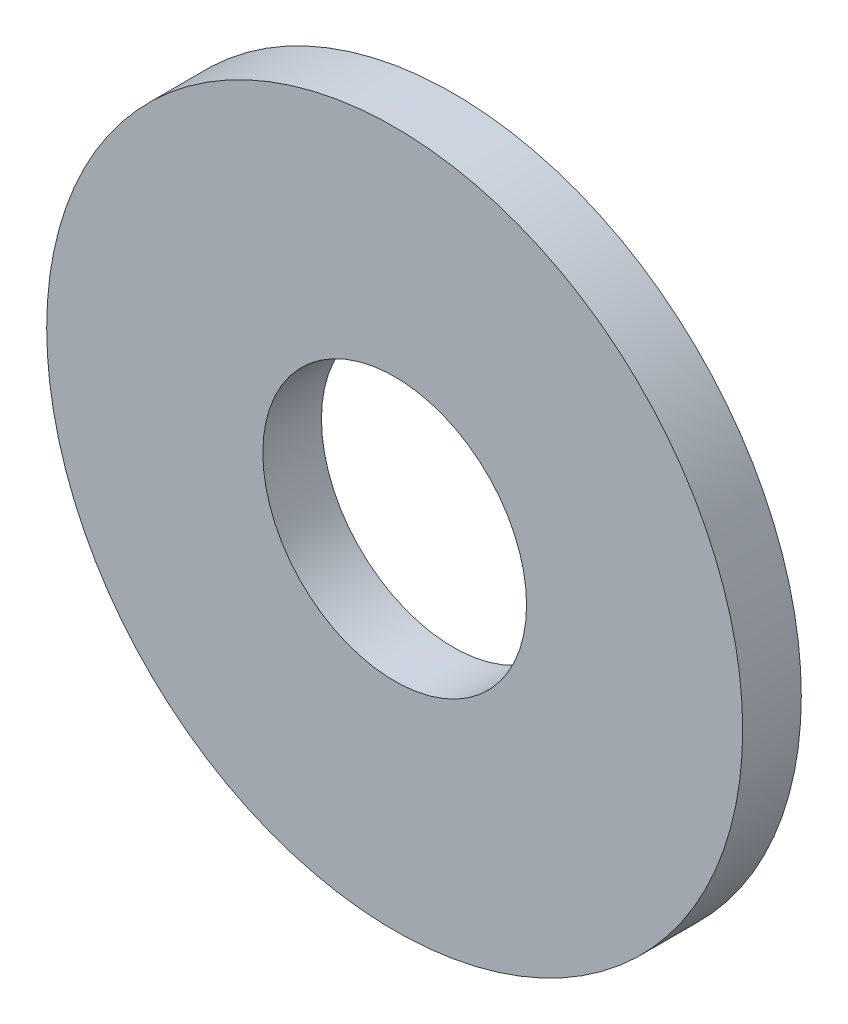
ISO-10303-21;
HEADER;
FILE_DESCRIPTION(('STEP AP214'),'2;1');
FILE_NAME('part.step','',(''),(''),'','','');
FILE_SCHEMA(('AUTOMOTIVE_DESIGN { 1 0 10303 214 1 1 1 1 }'));
ENDSEC;
DATA;
#1=APPLICATION_CONTEXT('core data for automotive mechanical design processes');
#2=APPLICATION_PROTOCOL_DEFINITION('international standard','automotive_design',2000,#1);
#3=PRODUCT_CONTEXT('',#1,'mechanical');
#4=PRODUCT('Part','Part','',(#3));
#5=PRODUCT_RELATED_PRODUCT_CATEGORY('part','',(#4));
#6=PRODUCT_DEFINITION_FORMATION('','',#4);
#7=PRODUCT_DEFINITION_CONTEXT('part definition',#1,'design');
#8=PRODUCT_DEFINITION('design','',#6,#7);
#9=PRODUCT_DEFINITION_SHAPE('','',#8);
#10=(LENGTH_UNIT() NAMED_UNIT(*) SI_UNIT(.MILLI.,.METRE.));
#11=(NAMED_UNIT(*) PLANE_ANGLE_UNIT() SI_UNIT($,.RADIAN.));
#12=(NAMED_UNIT(*) SI_UNIT($,.STERADIAN.) SOLID_ANGLE_UNIT());
#13=UNCERTAINTY_MEASURE_WITH_UNIT(LENGTH_MEASURE(1.E-05),#10,'distance_accuracy_value','');
#14=(GEOMETRIC_REPRESENTATION_CONTEXT(3) GLOBAL_UNCERTAINTY_ASSIGNED_CONTEXT((#13)) GLOBAL_UNIT_ASSIGNED_CONTEXT((#10,
#11,#12)) REPRESENTATION_CONTEXT('',''));
#15=CARTESIAN_POINT('',(0.,0.,0.));
#16=DIRECTION('',(0.,0.,1.));
#17=DIRECTION('',(1.,0.,0.));
#18=AXIS2_PLACEMENT_3D('',#15,#16,#17);
#19=CARTESIAN_POINT('',(0.,4.75,0.));
#20=DIRECTION('',(0.,0.,-1.));
#21=DIRECTION('',(-1.,0.,0.));
#22=AXIS2_PLACEMENT_3D('',#19,#20,#21);
#23=PLANE('',#22);
#24=CARTESIAN_POINT('',(0.,0.,0.));
#25=DIRECTION('',(0.,0.,1.));
#26=DIRECTION('',(1.,0.,0.));
#27=AXIS2_PLACEMENT_3D('',#24,#25,#26);
#28=CIRCLE('',#27,1.8);
#29=CARTESIAN_POINT('',(1.8,0.,0.));
#30=VERTEX_POINT('',#29);
#31=EDGE_CURVE('E10',#30,#30,#28,.T.);
#32=ORIENTED_EDGE('',*,*,#31,.F.);
#33=EDGE_LOOP('',(#32));
#34=FACE_BOUND('',#33,.T.);
#35=CARTESIAN_POINT('',(0.,0.,0.));
#36=DIRECTION('',(0.,0.,1.));
#37=DIRECTION('',(1.,0.,0.));
#38=AXIS2_PLACEMENT_3D('',#35,#36,#37);
#39=CIRCLE('',#38,4.75);
#40=CARTESIAN_POINT('',(4.75,0.,0.));
#41=VERTEX_POINT('',#40);
#42=EDGE_CURVE('E46',#41,#41,#39,.T.);
#43=ORIENTED_EDGE('',*,*,#42,.T.);
#44=EDGE_LOOP('',(#43));
#45=FACE_BOUND('',#44,.T.);
#46=ADVANCED_FACE('F32',(#34,#45),#23,.F.);
#47=CARTESIAN_POINT('',(0.,0.,0.));
#48=DIRECTION('',(0.,0.,1.));
#49=DIRECTION('',(1.,0.,0.));
#50=AXIS2_PLACEMENT_3D('',#47,#48,#49);
#51=CYLINDRICAL_SURFACE('',#50,1.8);
#52=CARTESIAN_POINT('',(0.,0.,-0.8));
#53=DIRECTION('',(0.,0.,1.));
#54=DIRECTION('',(1.,0.,0.));
#55=AXIS2_PLACEMENT_3D('',#52,#53,#54);
#56=CIRCLE('',#55,1.8);
#57=CARTESIAN_POINT('',(1.8,0.,-0.8));
#58=VERTEX_POINT('',#57);
#59=EDGE_CURVE('E38',#58,#58,#56,.T.);
#60=ORIENTED_EDGE('',*,*,#59,.F.);
#61=EDGE_LOOP('',(#60));
#62=FACE_BOUND('',#61,.T.);
#63=ORIENTED_EDGE('',*,*,#31,.T.);
#64=EDGE_LOOP('',(#63));
#65=FACE_BOUND('',#64,.T.);
#66=ADVANCED_FACE('F61',(#62,#65),#51,.F.);
#67=CARTESIAN_POINT('',(0.,4.75,-0.8));
#68=DIRECTION('',(0.,0.,1.));
#69=DIRECTION('',(1.,0.,0.));
#70=AXIS2_PLACEMENT_3D('',#67,#68,#69);
#71=PLANE('',#70);
#72=CARTESIAN_POINT('',(0.,0.,-0.8));
#73=DIRECTION('',(0.,0.,1.));
#74=DIRECTION('',(1.,0.,0.));
#75=AXIS2_PLACEMENT_3D('',#72,#73,#74);
#76=CIRCLE('',#75,4.75);
#77=CARTESIAN_POINT('',(4.75,0.,-0.8));
#78=VERTEX_POINT('',#77);
#79=EDGE_CURVE('E42',#78,#78,#76,.T.);
#80=ORIENTED_EDGE('',*,*,#79,.F.);
#81=EDGE_LOOP('',(#80));
#82=FACE_BOUND('',#81,.T.);
#83=ORIENTED_EDGE('',*,*,#59,.T.);
#84=EDGE_LOOP('',(#83));
#85=FACE_BOUND('',#84,.T.);
#86=ADVANCED_FACE('F56',(#82,#85),#71,.F.);
#87=CARTESIAN_POINT('',(0.,0.,0.));
#88=DIRECTION('',(0.,0.,1.));
#89=DIRECTION('',(1.,0.,0.));
#90=AXIS2_PLACEMENT_3D('',#87,#88,#89);
#91=CYLINDRICAL_SURFACE('',#90,4.75);
#92=ORIENTED_EDGE('',*,*,#42,.F.);
#93=EDGE_LOOP('',(#92));
#94=FACE_BOUND('',#93,.T.);
#95=ORIENTED_EDGE('',*,*,#79,.T.);
#96=EDGE_LOOP('',(#95));
#97=FACE_BOUND('',#96,.T.);
#98=ADVANCED_FACE('F53',(#94,#97),#91,.T.);
#99=CLOSED_SHELL('',(#46,#66,#86,#98));
#100=MANIFOLD_SOLID_BREP('B2',#99);
#101=ADVANCED_BREP_SHAPE_REPRESENTATION('',(#18,#100),#14);
#102=SHAPE_DEFINITION_REPRESENTATION(#9,#101);
ENDSEC;
END-ISO-10303-21;
